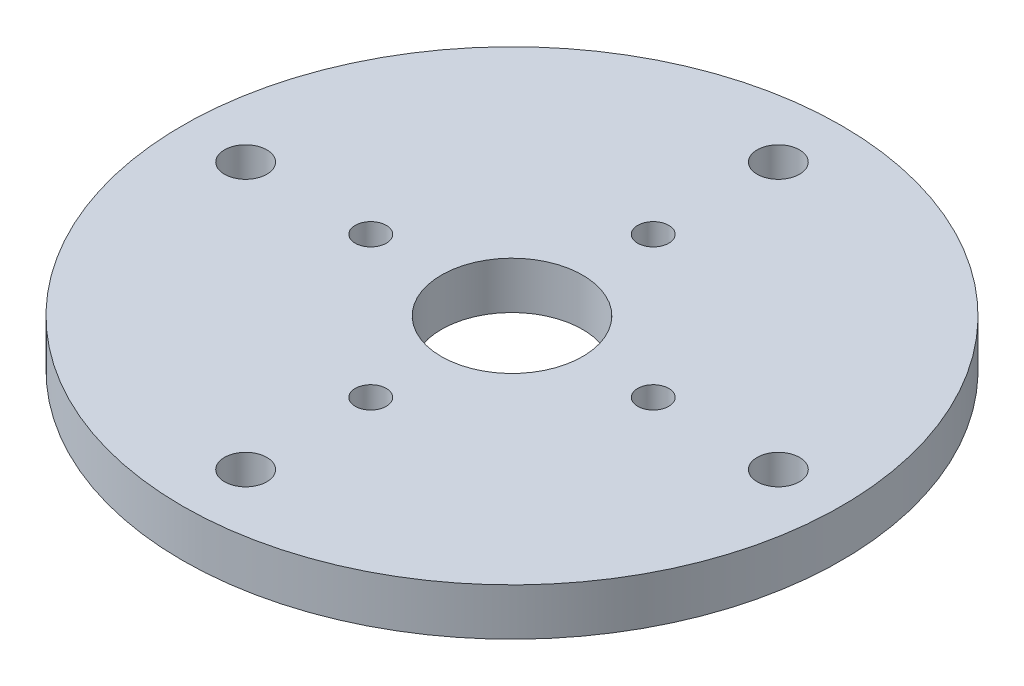
ISO-10303-21;
HEADER;
FILE_DESCRIPTION(('STEP AP214'),'2;1');
FILE_NAME('part.step','',(''),(''),'','','');
FILE_SCHEMA(('AUTOMOTIVE_DESIGN { 1 0 10303 214 1 1 1 1 }'));
ENDSEC;
DATA;
#1=APPLICATION_CONTEXT('core data for automotive mechanical design processes');
#2=APPLICATION_PROTOCOL_DEFINITION('international standard','automotive_design',2000,#1);
#3=PRODUCT_CONTEXT('',#1,'mechanical');
#4=PRODUCT('Part','Part','',(#3));
#5=PRODUCT_RELATED_PRODUCT_CATEGORY('part','',(#4));
#6=PRODUCT_DEFINITION_FORMATION('','',#4);
#7=PRODUCT_DEFINITION_CONTEXT('part definition',#1,'design');
#8=PRODUCT_DEFINITION('design','',#6,#7);
#9=PRODUCT_DEFINITION_SHAPE('','',#8);
#10=(LENGTH_UNIT() NAMED_UNIT(*) SI_UNIT(.MILLI.,.METRE.));
#11=(NAMED_UNIT(*) PLANE_ANGLE_UNIT() SI_UNIT($,.RADIAN.));
#12=(NAMED_UNIT(*) SI_UNIT($,.STERADIAN.) SOLID_ANGLE_UNIT());
#13=UNCERTAINTY_MEASURE_WITH_UNIT(LENGTH_MEASURE(1.E-05),#10,'distance_accuracy_value','');
#14=(GEOMETRIC_REPRESENTATION_CONTEXT(3) GLOBAL_UNCERTAINTY_ASSIGNED_CONTEXT((#13)) GLOBAL_UNIT_ASSIGNED_CONTEXT((#10,
#11,#12)) REPRESENTATION_CONTEXT('',''));
#15=CARTESIAN_POINT('',(0.,0.,0.));
#16=DIRECTION('',(0.,0.,1.));
#17=DIRECTION('',(1.,0.,0.));
#18=AXIS2_PLACEMENT_3D('',#15,#16,#17);
#19=CARTESIAN_POINT('',(0.,5.,0.));
#20=DIRECTION('',(0.,-1.,0.));
#21=DIRECTION('',(0.,0.,-1.));
#22=AXIS2_PLACEMENT_3D('',#19,#20,#21);
#23=CYLINDRICAL_SURFACE('',#22,35.);
#24=CARTESIAN_POINT('',(0.,5.,0.));
#25=DIRECTION('',(0.,1.,0.));
#26=DIRECTION('',(0.,0.,1.));
#27=AXIS2_PLACEMENT_3D('',#24,#25,#26);
#28=CIRCLE('',#27,35.);
#29=CARTESIAN_POINT('',(0.,5.,35.));
#30=VERTEX_POINT('',#29);
#31=EDGE_CURVE('E10',#30,#30,#28,.T.);
#32=ORIENTED_EDGE('',*,*,#31,.F.);
#33=EDGE_LOOP('',(#32));
#34=FACE_BOUND('',#33,.T.);
#35=CARTESIAN_POINT('',(0.,0.,0.));
#36=DIRECTION('',(0.,1.,0.));
#37=DIRECTION('',(0.,0.,1.));
#38=AXIS2_PLACEMENT_3D('',#35,#36,#37);
#39=CIRCLE('',#38,35.);
#40=CARTESIAN_POINT('',(0.,0.,35.));
#41=VERTEX_POINT('',#40);
#42=EDGE_CURVE('E40',#41,#41,#39,.T.);
#43=ORIENTED_EDGE('',*,*,#42,.T.);
#44=EDGE_LOOP('',(#43));
#45=FACE_BOUND('',#44,.T.);
#46=ADVANCED_FACE('F37',(#34,#45),#23,.T.);
#47=CARTESIAN_POINT('',(0.,5.,0.));
#48=DIRECTION('',(0.,1.,0.));
#49=DIRECTION('',(0.,0.,1.));
#50=AXIS2_PLACEMENT_3D('',#47,#48,#49);
#51=PLANE('',#50);
#52=CARTESIAN_POINT('',(0.,5.,0.));
#53=DIRECTION('',(0.,1.,0.));
#54=DIRECTION('',(0.,0.,1.));
#55=AXIS2_PLACEMENT_3D('',#52,#53,#54);
#56=CIRCLE('',#55,7.5);
#57=CARTESIAN_POINT('',(0.,5.,7.5));
#58=VERTEX_POINT('',#57);
#59=EDGE_CURVE('E115',#58,#58,#56,.T.);
#60=ORIENTED_EDGE('',*,*,#59,.F.);
#61=EDGE_LOOP('',(#60));
#62=FACE_BOUND('',#61,.T.);
#63=CARTESIAN_POINT('',(-15.,5.,0.));
#64=DIRECTION('',(0.,1.,0.));
#65=DIRECTION('',(1.,0.,0.));
#66=AXIS2_PLACEMENT_3D('',#63,#64,#65);
#67=CIRCLE('',#66,1.65);
#68=CARTESIAN_POINT('',(-13.35,5.,0.));
#69=VERTEX_POINT('',#68);
#70=EDGE_CURVE('E108',#69,#69,#67,.T.);
#71=ORIENTED_EDGE('',*,*,#70,.F.);
#72=EDGE_LOOP('',(#71));
#73=FACE_BOUND('',#72,.T.);
#74=CARTESIAN_POINT('',(0.,5.,15.));
#75=DIRECTION('',(0.,1.,0.));
#76=DIRECTION('',(0.,0.,-1.));
#77=AXIS2_PLACEMENT_3D('',#74,#75,#76);
#78=CIRCLE('',#77,1.65);
#79=CARTESIAN_POINT('',(0.,5.,13.35));
#80=VERTEX_POINT('',#79);
#81=EDGE_CURVE('E100',#80,#80,#78,.T.);
#82=ORIENTED_EDGE('',*,*,#81,.F.);
#83=EDGE_LOOP('',(#82));
#84=FACE_BOUND('',#83,.T.);
#85=CARTESIAN_POINT('',(15.,5.,-1.57116660247941E-13));
#86=DIRECTION('',(0.,1.,0.));
#87=DIRECTION('',(-1.,0.,0.));
#88=AXIS2_PLACEMENT_3D('',#85,#86,#87);
#89=CIRCLE('',#88,1.65);
#90=CARTESIAN_POINT('',(13.35,5.,-1.39833827620668E-13));
#91=VERTEX_POINT('',#90);
#92=EDGE_CURVE('E91',#91,#91,#89,.T.);
#93=ORIENTED_EDGE('',*,*,#92,.F.);
#94=EDGE_LOOP('',(#93));
#95=FACE_BOUND('',#94,.T.);
#96=CARTESIAN_POINT('',(0.,5.,-15.));
#97=DIRECTION('',(0.,1.,0.));
#98=DIRECTION('',(0.,0.,1.));
#99=AXIS2_PLACEMENT_3D('',#96,#97,#98);
#100=CIRCLE('',#99,1.65);
#101=CARTESIAN_POINT('',(0.,5.,-13.35));
#102=VERTEX_POINT('',#101);
#103=EDGE_CURVE('E83',#102,#102,#100,.T.);
#104=ORIENTED_EDGE('',*,*,#103,.F.);
#105=EDGE_LOOP('',(#104));
#106=FACE_BOUND('',#105,.T.);
#107=CARTESIAN_POINT('',(-28.285,5.,0.));
#108=DIRECTION('',(0.,1.,0.));
#109=DIRECTION('',(1.,0.,0.));
#110=AXIS2_PLACEMENT_3D('',#107,#108,#109);
#111=CIRCLE('',#110,2.25);
#112=CARTESIAN_POINT('',(-26.035,5.,0.));
#113=VERTEX_POINT('',#112);
#114=EDGE_CURVE('E76',#113,#113,#111,.T.);
#115=ORIENTED_EDGE('',*,*,#114,.F.);
#116=EDGE_LOOP('',(#115));
#117=FACE_BOUND('',#116,.T.);
#118=CARTESIAN_POINT('',(0.,5.,28.285));
#119=DIRECTION('',(0.,1.,0.));
#120=DIRECTION('',(0.,0.,-1.));
#121=AXIS2_PLACEMENT_3D('',#118,#119,#120);
#122=CIRCLE('',#121,2.25);
#123=CARTESIAN_POINT('',(0.,5.,26.035));
#124=VERTEX_POINT('',#123);
#125=EDGE_CURVE('E68',#124,#124,#122,.T.);
#126=ORIENTED_EDGE('',*,*,#125,.F.);
#127=EDGE_LOOP('',(#126));
#128=FACE_BOUND('',#127,.T.);
#129=CARTESIAN_POINT('',(28.285,5.,-2.96269649007534E-13));
#130=DIRECTION('',(0.,1.,0.));
#131=DIRECTION('',(-1.,0.,0.));
#132=AXIS2_PLACEMENT_3D('',#129,#130,#131);
#133=CIRCLE('',#132,2.25);
#134=CARTESIAN_POINT('',(26.035,5.,-2.72702149970343E-13));
#135=VERTEX_POINT('',#134);
#136=EDGE_CURVE('E59',#135,#135,#133,.T.);
#137=ORIENTED_EDGE('',*,*,#136,.F.);
#138=EDGE_LOOP('',(#137));
#139=FACE_BOUND('',#138,.T.);
#140=CARTESIAN_POINT('',(0.,5.,-28.285));
#141=DIRECTION('',(0.,1.,0.));
#142=DIRECTION('',(0.,0.,1.));
#143=AXIS2_PLACEMENT_3D('',#140,#141,#142);
#144=CIRCLE('',#143,2.25);
#145=CARTESIAN_POINT('',(0.,5.,-26.035));
#146=VERTEX_POINT('',#145);
#147=EDGE_CURVE('E51',#146,#146,#144,.T.);
#148=ORIENTED_EDGE('',*,*,#147,.F.);
#149=EDGE_LOOP('',(#148));
#150=FACE_BOUND('',#149,.T.);
#151=ORIENTED_EDGE('',*,*,#31,.T.);
#152=EDGE_LOOP('',(#151));
#153=FACE_BOUND('',#152,.T.);
#154=ADVANCED_FACE('F133',(#62,#73,#84,#95,#106,#117,#128,#139,#150,#153),#51,.T.);
#155=CARTESIAN_POINT('',(0.,0.,0.));
#156=DIRECTION('',(0.,1.,0.));
#157=DIRECTION('',(0.,0.,1.));
#158=AXIS2_PLACEMENT_3D('',#155,#156,#157);
#159=PLANE('',#158);
#160=CARTESIAN_POINT('',(0.,0.,0.));
#161=DIRECTION('',(0.,1.,0.));
#162=DIRECTION('',(0.,0.,1.));
#163=AXIS2_PLACEMENT_3D('',#160,#161,#162);
#164=CIRCLE('',#163,7.5);
#165=CARTESIAN_POINT('',(0.,0.,7.5));
#166=VERTEX_POINT('',#165);
#167=EDGE_CURVE('E96',#166,#166,#164,.T.);
#168=ORIENTED_EDGE('',*,*,#167,.T.);
#169=EDGE_LOOP('',(#168));
#170=FACE_BOUND('',#169,.T.);
#171=CARTESIAN_POINT('',(-15.,0.,0.));
#172=DIRECTION('',(0.,1.,0.));
#173=DIRECTION('',(1.,0.,0.));
#174=AXIS2_PLACEMENT_3D('',#171,#172,#173);
#175=CIRCLE('',#174,1.65);
#176=CARTESIAN_POINT('',(-13.35,0.,0.));
#177=VERTEX_POINT('',#176);
#178=EDGE_CURVE('E87',#177,#177,#175,.T.);
#179=ORIENTED_EDGE('',*,*,#178,.T.);
#180=EDGE_LOOP('',(#179));
#181=FACE_BOUND('',#180,.T.);
#182=CARTESIAN_POINT('',(0.,0.,15.));
#183=DIRECTION('',(0.,1.,0.));
#184=DIRECTION('',(0.,0.,-1.));
#185=AXIS2_PLACEMENT_3D('',#182,#183,#184);
#186=CIRCLE('',#185,1.65);
#187=CARTESIAN_POINT('',(0.,0.,13.35));
#188=VERTEX_POINT('',#187);
#189=EDGE_CURVE('E104',#188,#188,#186,.T.);
#190=ORIENTED_EDGE('',*,*,#189,.T.);
#191=EDGE_LOOP('',(#190));
#192=FACE_BOUND('',#191,.T.);
#193=CARTESIAN_POINT('',(15.,0.,-1.57116660247941E-13));
#194=DIRECTION('',(0.,1.,0.));
#195=DIRECTION('',(-1.,0.,0.));
#196=AXIS2_PLACEMENT_3D('',#193,#194,#195);
#197=CIRCLE('',#196,1.65);
#198=CARTESIAN_POINT('',(13.35,0.,-1.39833827620668E-13));
#199=VERTEX_POINT('',#198);
#200=EDGE_CURVE('E95',#199,#199,#197,.T.);
#201=ORIENTED_EDGE('',*,*,#200,.T.);
#202=EDGE_LOOP('',(#201));
#203=FACE_BOUND('',#202,.T.);
#204=CARTESIAN_POINT('',(0.,0.,-15.));
#205=DIRECTION('',(0.,1.,0.));
#206=DIRECTION('',(0.,0.,1.));
#207=AXIS2_PLACEMENT_3D('',#204,#205,#206);
#208=CIRCLE('',#207,1.65);
#209=CARTESIAN_POINT('',(0.,0.,-13.35));
#210=VERTEX_POINT('',#209);
#211=EDGE_CURVE('E64',#210,#210,#208,.T.);
#212=ORIENTED_EDGE('',*,*,#211,.T.);
#213=EDGE_LOOP('',(#212));
#214=FACE_BOUND('',#213,.T.);
#215=CARTESIAN_POINT('',(-28.285,0.,0.));
#216=DIRECTION('',(0.,1.,0.));
#217=DIRECTION('',(1.,0.,0.));
#218=AXIS2_PLACEMENT_3D('',#215,#216,#217);
#219=CIRCLE('',#218,2.25);
#220=CARTESIAN_POINT('',(-26.035,0.,0.));
#221=VERTEX_POINT('',#220);
#222=EDGE_CURVE('E55',#221,#221,#219,.T.);
#223=ORIENTED_EDGE('',*,*,#222,.T.);
#224=EDGE_LOOP('',(#223));
#225=FACE_BOUND('',#224,.T.);
#226=CARTESIAN_POINT('',(0.,0.,28.285));
#227=DIRECTION('',(0.,1.,0.));
#228=DIRECTION('',(0.,0.,-1.));
#229=AXIS2_PLACEMENT_3D('',#226,#227,#228);
#230=CIRCLE('',#229,2.25);
#231=CARTESIAN_POINT('',(0.,0.,26.035));
#232=VERTEX_POINT('',#231);
#233=EDGE_CURVE('E72',#232,#232,#230,.T.);
#234=ORIENTED_EDGE('',*,*,#233,.T.);
#235=EDGE_LOOP('',(#234));
#236=FACE_BOUND('',#235,.T.);
#237=CARTESIAN_POINT('',(28.285,0.,-2.96269649007534E-13));
#238=DIRECTION('',(0.,1.,0.));
#239=DIRECTION('',(-1.,0.,0.));
#240=AXIS2_PLACEMENT_3D('',#237,#238,#239);
#241=CIRCLE('',#240,2.25);
#242=CARTESIAN_POINT('',(26.035,0.,-2.72702149970343E-13));
#243=VERTEX_POINT('',#242);
#244=EDGE_CURVE('E63',#243,#243,#241,.T.);
#245=ORIENTED_EDGE('',*,*,#244,.T.);
#246=EDGE_LOOP('',(#245));
#247=FACE_BOUND('',#246,.T.);
#248=CARTESIAN_POINT('',(0.,0.,-28.285));
#249=DIRECTION('',(0.,1.,0.));
#250=DIRECTION('',(0.,0.,1.));
#251=AXIS2_PLACEMENT_3D('',#248,#249,#250);
#252=CIRCLE('',#251,2.25);
#253=CARTESIAN_POINT('',(0.,0.,-26.035));
#254=VERTEX_POINT('',#253);
#255=EDGE_CURVE('E49',#254,#254,#252,.T.);
#256=ORIENTED_EDGE('',*,*,#255,.T.);
#257=EDGE_LOOP('',(#256));
#258=FACE_BOUND('',#257,.T.);
#259=ORIENTED_EDGE('',*,*,#42,.F.);
#260=EDGE_LOOP('',(#259));
#261=FACE_BOUND('',#260,.T.);
#262=ADVANCED_FACE('F123',(#170,#181,#192,#203,#214,#225,#236,#247,#258,#261),#159,.F.);
#263=CARTESIAN_POINT('',(0.,0.,-28.285));
#264=DIRECTION('',(0.,1.,0.));
#265=DIRECTION('',(0.,0.,1.));
#266=AXIS2_PLACEMENT_3D('',#263,#264,#265);
#267=CYLINDRICAL_SURFACE('',#266,2.25);
#268=ORIENTED_EDGE('',*,*,#255,.F.);
#269=EDGE_LOOP('',(#268));
#270=FACE_BOUND('',#269,.T.);
#271=ORIENTED_EDGE('',*,*,#147,.T.);
#272=EDGE_LOOP('',(#271));
#273=FACE_BOUND('',#272,.T.);
#274=ADVANCED_FACE('F153',(#270,#273),#267,.F.);
#275=CARTESIAN_POINT('',(28.285,0.,-2.96269649007534E-13));
#276=DIRECTION('',(0.,1.,0.));
#277=DIRECTION('',(0.,0.,1.));
#278=AXIS2_PLACEMENT_3D('',#275,#276,#277);
#279=CYLINDRICAL_SURFACE('',#278,2.25);
#280=ORIENTED_EDGE('',*,*,#244,.F.);
#281=EDGE_LOOP('',(#280));
#282=FACE_BOUND('',#281,.T.);
#283=ORIENTED_EDGE('',*,*,#136,.T.);
#284=EDGE_LOOP('',(#283));
#285=FACE_BOUND('',#284,.T.);
#286=ADVANCED_FACE('F155',(#282,#285),#279,.F.);
#287=CARTESIAN_POINT('',(0.,0.,28.285));
#288=DIRECTION('',(0.,1.,0.));
#289=DIRECTION('',(0.,0.,1.));
#290=AXIS2_PLACEMENT_3D('',#287,#288,#289);
#291=CYLINDRICAL_SURFACE('',#290,2.25);
#292=ORIENTED_EDGE('',*,*,#233,.F.);
#293=EDGE_LOOP('',(#292));
#294=FACE_BOUND('',#293,.T.);
#295=ORIENTED_EDGE('',*,*,#125,.T.);
#296=EDGE_LOOP('',(#295));
#297=FACE_BOUND('',#296,.T.);
#298=ADVANCED_FACE('F162',(#294,#297),#291,.F.);
#299=CARTESIAN_POINT('',(-28.285,0.,0.));
#300=DIRECTION('',(0.,1.,0.));
#301=DIRECTION('',(0.,0.,1.));
#302=AXIS2_PLACEMENT_3D('',#299,#300,#301);
#303=CYLINDRICAL_SURFACE('',#302,2.25);
#304=ORIENTED_EDGE('',*,*,#222,.F.);
#305=EDGE_LOOP('',(#304));
#306=FACE_BOUND('',#305,.T.);
#307=ORIENTED_EDGE('',*,*,#114,.T.);
#308=EDGE_LOOP('',(#307));
#309=FACE_BOUND('',#308,.T.);
#310=ADVANCED_FACE('F220',(#306,#309),#303,.F.);
#311=CARTESIAN_POINT('',(0.,0.,-15.));
#312=DIRECTION('',(0.,1.,0.));
#313=DIRECTION('',(0.,0.,1.));
#314=AXIS2_PLACEMENT_3D('',#311,#312,#313);
#315=CYLINDRICAL_SURFACE('',#314,1.65);
#316=ORIENTED_EDGE('',*,*,#211,.F.);
#317=EDGE_LOOP('',(#316));
#318=FACE_BOUND('',#317,.T.);
#319=ORIENTED_EDGE('',*,*,#103,.T.);
#320=EDGE_LOOP('',(#319));
#321=FACE_BOUND('',#320,.T.);
#322=ADVANCED_FACE('F212',(#318,#321),#315,.F.);
#323=CARTESIAN_POINT('',(15.,0.,-1.57116660247941E-13));
#324=DIRECTION('',(0.,1.,0.));
#325=DIRECTION('',(0.,0.,1.));
#326=AXIS2_PLACEMENT_3D('',#323,#324,#325);
#327=CYLINDRICAL_SURFACE('',#326,1.65);
#328=ORIENTED_EDGE('',*,*,#200,.F.);
#329=EDGE_LOOP('',(#328));
#330=FACE_BOUND('',#329,.T.);
#331=ORIENTED_EDGE('',*,*,#92,.T.);
#332=EDGE_LOOP('',(#331));
#333=FACE_BOUND('',#332,.T.);
#334=ADVANCED_FACE('F204',(#330,#333),#327,.F.);
#335=CARTESIAN_POINT('',(0.,0.,15.));
#336=DIRECTION('',(0.,1.,0.));
#337=DIRECTION('',(0.,0.,1.));
#338=AXIS2_PLACEMENT_3D('',#335,#336,#337);
#339=CYLINDRICAL_SURFACE('',#338,1.65);
#340=ORIENTED_EDGE('',*,*,#189,.F.);
#341=EDGE_LOOP('',(#340));
#342=FACE_BOUND('',#341,.T.);
#343=ORIENTED_EDGE('',*,*,#81,.T.);
#344=EDGE_LOOP('',(#343));
#345=FACE_BOUND('',#344,.T.);
#346=ADVANCED_FACE('F197',(#342,#345),#339,.F.);
#347=CARTESIAN_POINT('',(-15.,0.,0.));
#348=DIRECTION('',(0.,1.,0.));
#349=DIRECTION('',(0.,0.,1.));
#350=AXIS2_PLACEMENT_3D('',#347,#348,#349);
#351=CYLINDRICAL_SURFACE('',#350,1.65);
#352=ORIENTED_EDGE('',*,*,#178,.F.);
#353=EDGE_LOOP('',(#352));
#354=FACE_BOUND('',#353,.T.);
#355=ORIENTED_EDGE('',*,*,#70,.T.);
#356=EDGE_LOOP('',(#355));
#357=FACE_BOUND('',#356,.T.);
#358=ADVANCED_FACE('F129',(#354,#357),#351,.F.);
#359=CARTESIAN_POINT('',(0.,0.,0.));
#360=DIRECTION('',(0.,1.,0.));
#361=DIRECTION('',(0.,0.,1.));
#362=AXIS2_PLACEMENT_3D('',#359,#360,#361);
#363=CYLINDRICAL_SURFACE('',#362,7.5);
#364=ORIENTED_EDGE('',*,*,#167,.F.);
#365=EDGE_LOOP('',(#364));
#366=FACE_BOUND('',#365,.T.);
#367=ORIENTED_EDGE('',*,*,#59,.T.);
#368=EDGE_LOOP('',(#367));
#369=FACE_BOUND('',#368,.T.);
#370=ADVANCED_FACE('F126',(#366,#369),#363,.F.);
#371=CLOSED_SHELL('',(#46,#154,#262,#274,#286,#298,#310,#322,#334,#346,#358,#370));
#372=MANIFOLD_SOLID_BREP('B2',#371);
#373=ADVANCED_BREP_SHAPE_REPRESENTATION('',(#18,#372),#14);
#374=SHAPE_DEFINITION_REPRESENTATION(#9,#373);
ENDSEC;
END-ISO-10303-21;
